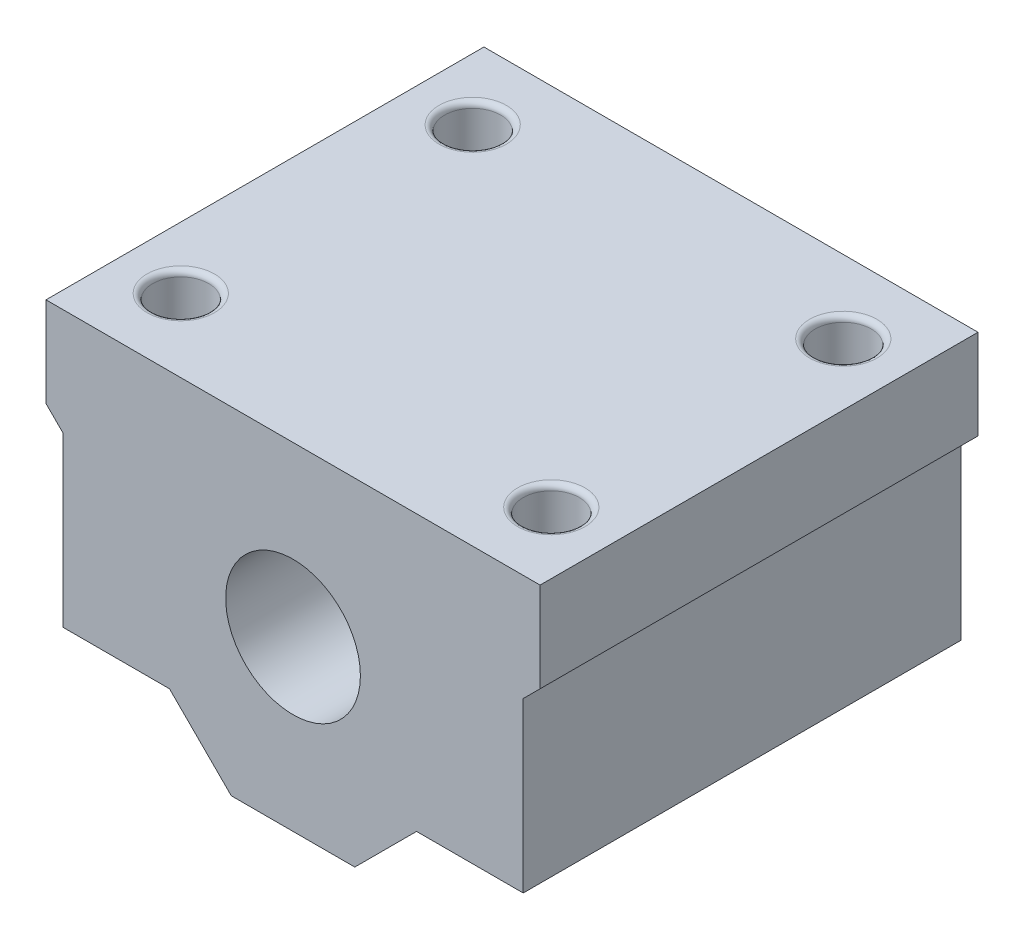
ISO-10303-21;
HEADER;
FILE_DESCRIPTION(('STEP AP214'),'2;1');
FILE_NAME('part.step','',(''),(''),'','','');
FILE_SCHEMA(('AUTOMOTIVE_DESIGN { 1 0 10303 214 1 1 1 1 }'));
ENDSEC;
DATA;
#1=APPLICATION_CONTEXT('core data for automotive mechanical design processes');
#2=APPLICATION_PROTOCOL_DEFINITION('international standard','automotive_design',2000,#1);
#3=PRODUCT_CONTEXT('',#1,'mechanical');
#4=PRODUCT('Part','Part','',(#3));
#5=PRODUCT_RELATED_PRODUCT_CATEGORY('part','',(#4));
#6=PRODUCT_DEFINITION_FORMATION('','',#4);
#7=PRODUCT_DEFINITION_CONTEXT('part definition',#1,'design');
#8=PRODUCT_DEFINITION('design','',#6,#7);
#9=PRODUCT_DEFINITION_SHAPE('','',#8);
#10=(LENGTH_UNIT() NAMED_UNIT(*) SI_UNIT(.MILLI.,.METRE.));
#11=(NAMED_UNIT(*) PLANE_ANGLE_UNIT() SI_UNIT($,.RADIAN.));
#12=(NAMED_UNIT(*) SI_UNIT($,.STERADIAN.) SOLID_ANGLE_UNIT());
#13=UNCERTAINTY_MEASURE_WITH_UNIT(LENGTH_MEASURE(1.E-05),#10,'distance_accuracy_value','');
#14=(GEOMETRIC_REPRESENTATION_CONTEXT(3) GLOBAL_UNCERTAINTY_ASSIGNED_CONTEXT((#13)) GLOBAL_UNIT_ASSIGNED_CONTEXT((#10,
#11,#12)) REPRESENTATION_CONTEXT('',''));
#15=CARTESIAN_POINT('',(0.,0.,0.));
#16=DIRECTION('',(0.,0.,1.));
#17=DIRECTION('',(1.,0.,0.));
#18=AXIS2_PLACEMENT_3D('',#15,#16,#17);
#19=CARTESIAN_POINT('',(0.,0.,39.));
#20=DIRECTION('',(0.,0.,1.));
#21=DIRECTION('',(1.,0.,0.));
#22=AXIS2_PLACEMENT_3D('',#19,#20,#21);
#23=PLANE('',#22);
#24=DIRECTION('',(0.,-1.,0.));
#25=VECTOR('',#24,1.);
#26=CARTESIAN_POINT('',(-22.,15.,39.));
#27=LINE('',#26,#25);
#28=CARTESIAN_POINT('',(-22.,15.,39.));
#29=VERTEX_POINT('',#28);
#30=CARTESIAN_POINT('',(-22.,7.,39.));
#31=VERTEX_POINT('',#30);
#32=EDGE_CURVE('E179',#29,#31,#27,.T.);
#33=ORIENTED_EDGE('',*,*,#32,.T.);
#34=DIRECTION('',(0.707106781186549,-0.707106781186546,0.));
#35=VECTOR('',#34,1.);
#36=CARTESIAN_POINT('',(-22.,7.,39.));
#37=LINE('',#36,#35);
#38=CARTESIAN_POINT('',(-20.5,5.5,39.));
#39=VERTEX_POINT('',#38);
#40=EDGE_CURVE('E107',#31,#39,#37,.T.);
#41=ORIENTED_EDGE('',*,*,#40,.T.);
#42=DIRECTION('',(0.,-1.,0.));
#43=VECTOR('',#42,1.);
#44=CARTESIAN_POINT('',(-20.5,5.5,39.));
#45=LINE('',#44,#43);
#46=CARTESIAN_POINT('',(-20.5,-9.5,39.));
#47=VERTEX_POINT('',#46);
#48=EDGE_CURVE('E342',#39,#47,#45,.T.);
#49=ORIENTED_EDGE('',*,*,#48,.T.);
#50=DIRECTION('',(1.,0.,0.));
#51=VECTOR('',#50,1.);
#52=CARTESIAN_POINT('',(-20.5,-9.5,39.));
#53=LINE('',#52,#51);
#54=CARTESIAN_POINT('',(-11.,-9.5,39.));
#55=VERTEX_POINT('',#54);
#56=EDGE_CURVE('E344',#47,#55,#53,.T.);
#57=ORIENTED_EDGE('',*,*,#56,.T.);
#58=DIRECTION('',(0.707106781186546,-0.707106781186549,0.));
#59=VECTOR('',#58,1.);
#60=CARTESIAN_POINT('',(-11.,-9.5,39.));
#61=LINE('',#60,#59);
#62=CARTESIAN_POINT('',(-5.50000000000002,-15.,39.));
#63=VERTEX_POINT('',#62);
#64=EDGE_CURVE('E346',#55,#63,#61,.T.);
#65=ORIENTED_EDGE('',*,*,#64,.T.);
#66=DIRECTION('',(1.,0.,0.));
#67=VECTOR('',#66,1.);
#68=CARTESIAN_POINT('',(-5.50000000000002,-15.,39.));
#69=LINE('',#68,#67);
#70=CARTESIAN_POINT('',(5.50000000000002,-15.,39.));
#71=VERTEX_POINT('',#70);
#72=EDGE_CURVE('E348',#63,#71,#69,.T.);
#73=ORIENTED_EDGE('',*,*,#72,.T.);
#74=DIRECTION('',(0.707106781186546,0.707106781186549,0.));
#75=VECTOR('',#74,1.);
#76=CARTESIAN_POINT('',(11.,-9.5,39.));
#77=LINE('',#76,#75);
#78=CARTESIAN_POINT('',(11.,-9.5,39.));
#79=VERTEX_POINT('',#78);
#80=EDGE_CURVE('E350',#71,#79,#77,.T.);
#81=ORIENTED_EDGE('',*,*,#80,.T.);
#82=DIRECTION('',(1.,0.,0.));
#83=VECTOR('',#82,1.);
#84=CARTESIAN_POINT('',(20.5,-9.5,39.));
#85=LINE('',#84,#83);
#86=CARTESIAN_POINT('',(20.5,-9.5,39.));
#87=VERTEX_POINT('',#86);
#88=EDGE_CURVE('E352',#79,#87,#85,.T.);
#89=ORIENTED_EDGE('',*,*,#88,.T.);
#90=DIRECTION('',(0.,1.,0.));
#91=VECTOR('',#90,1.);
#92=CARTESIAN_POINT('',(20.5,5.5,39.));
#93=LINE('',#92,#91);
#94=CARTESIAN_POINT('',(20.5,5.5,39.));
#95=VERTEX_POINT('',#94);
#96=EDGE_CURVE('E138',#87,#95,#93,.T.);
#97=ORIENTED_EDGE('',*,*,#96,.T.);
#98=DIRECTION('',(0.707106781186549,0.707106781186546,0.));
#99=VECTOR('',#98,1.);
#100=CARTESIAN_POINT('',(22.,7.,39.));
#101=LINE('',#100,#99);
#102=CARTESIAN_POINT('',(22.,7.,39.));
#103=VERTEX_POINT('',#102);
#104=EDGE_CURVE('E132',#95,#103,#101,.T.);
#105=ORIENTED_EDGE('',*,*,#104,.T.);
#106=DIRECTION('',(0.,1.,0.));
#107=VECTOR('',#106,1.);
#108=CARTESIAN_POINT('',(22.,15.,39.));
#109=LINE('',#108,#107);
#110=CARTESIAN_POINT('',(22.,15.,39.));
#111=VERTEX_POINT('',#110);
#112=EDGE_CURVE('E136',#103,#111,#109,.T.);
#113=ORIENTED_EDGE('',*,*,#112,.T.);
#114=DIRECTION('',(-1.,0.,0.));
#115=VECTOR('',#114,1.);
#116=CARTESIAN_POINT('',(22.,15.,39.));
#117=LINE('',#116,#115);
#118=EDGE_CURVE('E51',#111,#29,#117,.T.);
#119=ORIENTED_EDGE('',*,*,#118,.T.);
#120=EDGE_LOOP('',(#33,#41,#49,#57,#65,#73,#81,#89,#97,#105,#113,#119));
#121=FACE_BOUND('',#120,.T.);
#122=CARTESIAN_POINT('',(0.,0.,39.));
#123=DIRECTION('',(0.,0.,1.));
#124=DIRECTION('',(1.,0.,0.));
#125=AXIS2_PLACEMENT_3D('',#122,#123,#124);
#126=CIRCLE('',#125,6.);
#127=CARTESIAN_POINT('',(6.,0.,39.));
#128=VERTEX_POINT('',#127);
#129=EDGE_CURVE('E160',#128,#128,#126,.T.);
#130=ORIENTED_EDGE('',*,*,#129,.F.);
#131=EDGE_LOOP('',(#130));
#132=FACE_BOUND('',#131,.T.);
#133=ADVANCED_FACE('F34',(#121,#132),#23,.T.);
#134=CARTESIAN_POINT('',(0.,0.,0.));
#135=DIRECTION('',(0.,0.,1.));
#136=DIRECTION('',(1.,0.,0.));
#137=AXIS2_PLACEMENT_3D('',#134,#135,#136);
#138=PLANE('',#137);
#139=CARTESIAN_POINT('',(0.,0.,0.));
#140=DIRECTION('',(0.,0.,1.));
#141=DIRECTION('',(1.,0.,0.));
#142=AXIS2_PLACEMENT_3D('',#139,#140,#141);
#143=CIRCLE('',#142,7.50000000000001);
#144=CARTESIAN_POINT('',(7.50000000000001,0.,0.));
#145=VERTEX_POINT('',#144);
#146=EDGE_CURVE('E206',#145,#145,#143,.T.);
#147=ORIENTED_EDGE('',*,*,#146,.T.);
#148=EDGE_LOOP('',(#147));
#149=FACE_BOUND('',#148,.T.);
#150=DIRECTION('',(0.,-1.,0.));
#151=VECTOR('',#150,1.);
#152=CARTESIAN_POINT('',(-22.,15.,0.));
#153=LINE('',#152,#151);
#154=CARTESIAN_POINT('',(-22.,15.,0.));
#155=VERTEX_POINT('',#154);
#156=CARTESIAN_POINT('',(-22.,7.,0.));
#157=VERTEX_POINT('',#156);
#158=EDGE_CURVE('E156',#155,#157,#153,.T.);
#159=ORIENTED_EDGE('',*,*,#158,.F.);
#160=DIRECTION('',(-1.,0.,0.));
#161=VECTOR('',#160,1.);
#162=CARTESIAN_POINT('',(22.,15.,0.));
#163=LINE('',#162,#161);
#164=CARTESIAN_POINT('',(22.,15.,0.));
#165=VERTEX_POINT('',#164);
#166=EDGE_CURVE('E98',#165,#155,#163,.T.);
#167=ORIENTED_EDGE('',*,*,#166,.F.);
#168=DIRECTION('',(0.,1.,0.));
#169=VECTOR('',#168,1.);
#170=CARTESIAN_POINT('',(22.,15.,0.));
#171=LINE('',#170,#169);
#172=CARTESIAN_POINT('',(22.,7.,0.));
#173=VERTEX_POINT('',#172);
#174=EDGE_CURVE('E92',#173,#165,#171,.T.);
#175=ORIENTED_EDGE('',*,*,#174,.F.);
#176=DIRECTION('',(0.707106781186549,0.707106781186546,0.));
#177=VECTOR('',#176,1.);
#178=CARTESIAN_POINT('',(22.,7.,0.));
#179=LINE('',#178,#177);
#180=CARTESIAN_POINT('',(20.5,5.5,0.));
#181=VERTEX_POINT('',#180);
#182=EDGE_CURVE('E146',#181,#173,#179,.T.);
#183=ORIENTED_EDGE('',*,*,#182,.F.);
#184=DIRECTION('',(0.,1.,0.));
#185=VECTOR('',#184,1.);
#186=CARTESIAN_POINT('',(20.5,5.5,0.));
#187=LINE('',#186,#185);
#188=CARTESIAN_POINT('',(20.5,-9.5,0.));
#189=VERTEX_POINT('',#188);
#190=EDGE_CURVE('E174',#189,#181,#187,.T.);
#191=ORIENTED_EDGE('',*,*,#190,.F.);
#192=DIRECTION('',(1.,0.,0.));
#193=VECTOR('',#192,1.);
#194=CARTESIAN_POINT('',(20.5,-9.5,0.));
#195=LINE('',#194,#193);
#196=CARTESIAN_POINT('',(11.,-9.5,0.));
#197=VERTEX_POINT('',#196);
#198=EDGE_CURVE('E172',#197,#189,#195,.T.);
#199=ORIENTED_EDGE('',*,*,#198,.F.);
#200=DIRECTION('',(0.707106781186546,0.707106781186549,0.));
#201=VECTOR('',#200,1.);
#202=CARTESIAN_POINT('',(11.,-9.5,0.));
#203=LINE('',#202,#201);
#204=CARTESIAN_POINT('',(5.50000000000002,-15.,0.));
#205=VERTEX_POINT('',#204);
#206=EDGE_CURVE('E170',#205,#197,#203,.T.);
#207=ORIENTED_EDGE('',*,*,#206,.F.);
#208=DIRECTION('',(1.,0.,0.));
#209=VECTOR('',#208,1.);
#210=CARTESIAN_POINT('',(-5.50000000000002,-15.,0.));
#211=LINE('',#210,#209);
#212=CARTESIAN_POINT('',(-5.50000000000002,-15.,0.));
#213=VERTEX_POINT('',#212);
#214=EDGE_CURVE('E168',#213,#205,#211,.T.);
#215=ORIENTED_EDGE('',*,*,#214,.F.);
#216=DIRECTION('',(0.707106781186546,-0.707106781186549,0.));
#217=VECTOR('',#216,1.);
#218=CARTESIAN_POINT('',(-11.,-9.5,0.));
#219=LINE('',#218,#217);
#220=CARTESIAN_POINT('',(-11.,-9.5,0.));
#221=VERTEX_POINT('',#220);
#222=EDGE_CURVE('E166',#221,#213,#219,.T.);
#223=ORIENTED_EDGE('',*,*,#222,.F.);
#224=DIRECTION('',(1.,0.,0.));
#225=VECTOR('',#224,1.);
#226=CARTESIAN_POINT('',(-20.5,-9.5,0.));
#227=LINE('',#226,#225);
#228=CARTESIAN_POINT('',(-20.5,-9.5,0.));
#229=VERTEX_POINT('',#228);
#230=EDGE_CURVE('E164',#229,#221,#227,.T.);
#231=ORIENTED_EDGE('',*,*,#230,.F.);
#232=DIRECTION('',(0.,-1.,0.));
#233=VECTOR('',#232,1.);
#234=CARTESIAN_POINT('',(-20.5,5.5,0.));
#235=LINE('',#234,#233);
#236=CARTESIAN_POINT('',(-20.5,5.5,0.));
#237=VERTEX_POINT('',#236);
#238=EDGE_CURVE('E162',#237,#229,#235,.T.);
#239=ORIENTED_EDGE('',*,*,#238,.F.);
#240=DIRECTION('',(0.707106781186549,-0.707106781186546,0.));
#241=VECTOR('',#240,1.);
#242=CARTESIAN_POINT('',(-22.,7.,0.));
#243=LINE('',#242,#241);
#244=EDGE_CURVE('E159',#157,#237,#243,.T.);
#245=ORIENTED_EDGE('',*,*,#244,.F.);
#246=EDGE_LOOP('',(#159,#167,#175,#183,#191,#199,#207,#215,#223,#231,#239,#245));
#247=FACE_BOUND('',#246,.T.);
#248=ADVANCED_FACE('F255',(#149,#247),#138,.F.);
#249=CARTESIAN_POINT('',(-22.,15.,39.));
#250=DIRECTION('',(1.,0.,0.));
#251=DIRECTION('',(0.,0.,-1.));
#252=AXIS2_PLACEMENT_3D('',#249,#250,#251);
#253=PLANE('',#252);
#254=ORIENTED_EDGE('',*,*,#158,.T.);
#255=DIRECTION('',(0.,0.,-1.));
#256=VECTOR('',#255,1.);
#257=CARTESIAN_POINT('',(-22.,7.,39.));
#258=LINE('',#257,#256);
#259=EDGE_CURVE('E204',#31,#157,#258,.T.);
#260=ORIENTED_EDGE('',*,*,#259,.F.);
#261=ORIENTED_EDGE('',*,*,#32,.F.);
#262=DIRECTION('',(0.,0.,-1.));
#263=VECTOR('',#262,1.);
#264=CARTESIAN_POINT('',(-22.,15.,39.));
#265=LINE('',#264,#263);
#266=EDGE_CURVE('E152',#29,#155,#265,.T.);
#267=ORIENTED_EDGE('',*,*,#266,.T.);
#268=EDGE_LOOP('',(#254,#260,#261,#267));
#269=FACE_BOUND('',#268,.T.);
#270=ADVANCED_FACE('F260',(#269),#253,.F.);
#271=CARTESIAN_POINT('',(-22.,7.,39.));
#272=DIRECTION('',(0.707106781186546,0.707106781186549,0.));
#273=DIRECTION('',(-0.707106781186549,0.707106781186546,0.));
#274=AXIS2_PLACEMENT_3D('',#271,#272,#273);
#275=PLANE('',#274);
#276=ORIENTED_EDGE('',*,*,#244,.T.);
#277=DIRECTION('',(0.,0.,-1.));
#278=VECTOR('',#277,1.);
#279=CARTESIAN_POINT('',(-20.5,5.5,39.));
#280=LINE('',#279,#278);
#281=EDGE_CURVE('E201',#39,#237,#280,.T.);
#282=ORIENTED_EDGE('',*,*,#281,.F.);
#283=ORIENTED_EDGE('',*,*,#40,.F.);
#284=ORIENTED_EDGE('',*,*,#259,.T.);
#285=EDGE_LOOP('',(#276,#282,#283,#284));
#286=FACE_BOUND('',#285,.T.);
#287=ADVANCED_FACE('F297',(#286),#275,.F.);
#288=CARTESIAN_POINT('',(-20.5,5.5,39.));
#289=DIRECTION('',(1.,0.,0.));
#290=DIRECTION('',(0.,0.,-1.));
#291=AXIS2_PLACEMENT_3D('',#288,#289,#290);
#292=PLANE('',#291);
#293=ORIENTED_EDGE('',*,*,#238,.T.);
#294=DIRECTION('',(0.,0.,-1.));
#295=VECTOR('',#294,1.);
#296=CARTESIAN_POINT('',(-20.5,-9.5,39.));
#297=LINE('',#296,#295);
#298=EDGE_CURVE('E198',#47,#229,#297,.T.);
#299=ORIENTED_EDGE('',*,*,#298,.F.);
#300=ORIENTED_EDGE('',*,*,#48,.F.);
#301=ORIENTED_EDGE('',*,*,#281,.T.);
#302=EDGE_LOOP('',(#293,#299,#300,#301));
#303=FACE_BOUND('',#302,.T.);
#304=ADVANCED_FACE('F293',(#303),#292,.F.);
#305=CARTESIAN_POINT('',(-20.5,-9.5,39.));
#306=DIRECTION('',(0.,1.,0.));
#307=DIRECTION('',(-1.,0.,0.));
#308=AXIS2_PLACEMENT_3D('',#305,#306,#307);
#309=PLANE('',#308);
#310=CARTESIAN_POINT('',(-16.5,-9.5,6.5));
#311=DIRECTION('',(0.,-1.,0.));
#312=DIRECTION('',(1.,0.,0.));
#313=AXIS2_PLACEMENT_3D('',#310,#311,#312);
#314=CIRCLE('',#313,2.5);
#315=CARTESIAN_POINT('',(-14.,-9.5,6.5));
#316=VERTEX_POINT('',#315);
#317=EDGE_CURVE('E331',#316,#316,#314,.T.);
#318=ORIENTED_EDGE('',*,*,#317,.F.);
#319=EDGE_LOOP('',(#318));
#320=FACE_BOUND('',#319,.T.);
#321=CARTESIAN_POINT('',(-16.5,-9.5,32.5));
#322=DIRECTION('',(0.,-1.,0.));
#323=DIRECTION('',(1.,0.,0.));
#324=AXIS2_PLACEMENT_3D('',#321,#322,#323);
#325=CIRCLE('',#324,2.5);
#326=CARTESIAN_POINT('',(-14.,-9.5,32.5));
#327=VERTEX_POINT('',#326);
#328=EDGE_CURVE('E335',#327,#327,#325,.T.);
#329=ORIENTED_EDGE('',*,*,#328,.F.);
#330=EDGE_LOOP('',(#329));
#331=FACE_BOUND('',#330,.T.);
#332=ORIENTED_EDGE('',*,*,#230,.T.);
#333=DIRECTION('',(0.,0.,-1.));
#334=VECTOR('',#333,1.);
#335=CARTESIAN_POINT('',(-11.,-9.5,39.));
#336=LINE('',#335,#334);
#337=EDGE_CURVE('E195',#55,#221,#336,.T.);
#338=ORIENTED_EDGE('',*,*,#337,.F.);
#339=ORIENTED_EDGE('',*,*,#56,.F.);
#340=ORIENTED_EDGE('',*,*,#298,.T.);
#341=EDGE_LOOP('',(#332,#338,#339,#340));
#342=FACE_BOUND('',#341,.T.);
#343=ADVANCED_FACE('F289',(#320,#331,#342),#309,.F.);
#344=CARTESIAN_POINT('',(-11.,-9.5,39.));
#345=DIRECTION('',(0.707106781186549,0.707106781186546,0.));
#346=DIRECTION('',(-0.707106781186546,0.707106781186549,0.));
#347=AXIS2_PLACEMENT_3D('',#344,#345,#346);
#348=PLANE('',#347);
#349=ORIENTED_EDGE('',*,*,#222,.T.);
#350=DIRECTION('',(0.,0.,-1.));
#351=VECTOR('',#350,1.);
#352=CARTESIAN_POINT('',(-5.50000000000002,-15.,39.));
#353=LINE('',#352,#351);
#354=EDGE_CURVE('E192',#63,#213,#353,.T.);
#355=ORIENTED_EDGE('',*,*,#354,.F.);
#356=ORIENTED_EDGE('',*,*,#64,.F.);
#357=ORIENTED_EDGE('',*,*,#337,.T.);
#358=EDGE_LOOP('',(#349,#355,#356,#357));
#359=FACE_BOUND('',#358,.T.);
#360=ADVANCED_FACE('F285',(#359),#348,.F.);
#361=CARTESIAN_POINT('',(-5.50000000000002,-15.,39.));
#362=DIRECTION('',(0.,1.,0.));
#363=DIRECTION('',(0.,0.,1.));
#364=AXIS2_PLACEMENT_3D('',#361,#362,#363);
#365=PLANE('',#364);
#366=ORIENTED_EDGE('',*,*,#214,.T.);
#367=DIRECTION('',(0.,0.,-1.));
#368=VECTOR('',#367,1.);
#369=CARTESIAN_POINT('',(5.50000000000002,-15.,39.));
#370=LINE('',#369,#368);
#371=EDGE_CURVE('E189',#71,#205,#370,.T.);
#372=ORIENTED_EDGE('',*,*,#371,.F.);
#373=ORIENTED_EDGE('',*,*,#72,.F.);
#374=ORIENTED_EDGE('',*,*,#354,.T.);
#375=EDGE_LOOP('',(#366,#372,#373,#374));
#376=FACE_BOUND('',#375,.T.);
#377=ADVANCED_FACE('F281',(#376),#365,.F.);
#378=CARTESIAN_POINT('',(11.,-9.5,39.));
#379=DIRECTION('',(-0.707106781186549,0.707106781186546,0.));
#380=DIRECTION('',(-0.707106781186546,-0.707106781186549,0.));
#381=AXIS2_PLACEMENT_3D('',#378,#379,#380);
#382=PLANE('',#381);
#383=ORIENTED_EDGE('',*,*,#206,.T.);
#384=DIRECTION('',(0.,0.,-1.));
#385=VECTOR('',#384,1.);
#386=CARTESIAN_POINT('',(11.,-9.5,39.));
#387=LINE('',#386,#385);
#388=EDGE_CURVE('E186',#79,#197,#387,.T.);
#389=ORIENTED_EDGE('',*,*,#388,.F.);
#390=ORIENTED_EDGE('',*,*,#80,.F.);
#391=ORIENTED_EDGE('',*,*,#371,.T.);
#392=EDGE_LOOP('',(#383,#389,#390,#391));
#393=FACE_BOUND('',#392,.T.);
#394=ADVANCED_FACE('F277',(#393),#382,.F.);
#395=CARTESIAN_POINT('',(20.5,-9.5,39.));
#396=DIRECTION('',(0.,1.,0.));
#397=DIRECTION('',(-1.,0.,0.));
#398=AXIS2_PLACEMENT_3D('',#395,#396,#397);
#399=PLANE('',#398);
#400=CARTESIAN_POINT('',(16.5,-9.5,32.5));
#401=DIRECTION('',(0.,-1.,0.));
#402=DIRECTION('',(1.,0.,0.));
#403=AXIS2_PLACEMENT_3D('',#400,#401,#402);
#404=CIRCLE('',#403,2.5);
#405=CARTESIAN_POINT('',(19.,-9.5,32.5));
#406=VERTEX_POINT('',#405);
#407=EDGE_CURVE('E327',#406,#406,#404,.T.);
#408=ORIENTED_EDGE('',*,*,#407,.F.);
#409=EDGE_LOOP('',(#408));
#410=FACE_BOUND('',#409,.T.);
#411=CARTESIAN_POINT('',(16.5,-9.5,6.49999999999999));
#412=DIRECTION('',(0.,-1.,0.));
#413=DIRECTION('',(1.,0.,0.));
#414=AXIS2_PLACEMENT_3D('',#411,#412,#413);
#415=CIRCLE('',#414,2.49999999999999);
#416=CARTESIAN_POINT('',(19.,-9.5,6.49999999999999));
#417=VERTEX_POINT('',#416);
#418=EDGE_CURVE('E328',#417,#417,#415,.T.);
#419=ORIENTED_EDGE('',*,*,#418,.F.);
#420=EDGE_LOOP('',(#419));
#421=FACE_BOUND('',#420,.T.);
#422=ORIENTED_EDGE('',*,*,#198,.T.);
#423=DIRECTION('',(0.,0.,-1.));
#424=VECTOR('',#423,1.);
#425=CARTESIAN_POINT('',(20.5,-9.5,39.));
#426=LINE('',#425,#424);
#427=EDGE_CURVE('E183',#87,#189,#426,.T.);
#428=ORIENTED_EDGE('',*,*,#427,.F.);
#429=ORIENTED_EDGE('',*,*,#88,.F.);
#430=ORIENTED_EDGE('',*,*,#388,.T.);
#431=EDGE_LOOP('',(#422,#428,#429,#430));
#432=FACE_BOUND('',#431,.T.);
#433=ADVANCED_FACE('F273',(#410,#421,#432),#399,.F.);
#434=CARTESIAN_POINT('',(20.5,5.5,39.));
#435=DIRECTION('',(-1.,0.,0.));
#436=DIRECTION('',(0.,0.,1.));
#437=AXIS2_PLACEMENT_3D('',#434,#435,#436);
#438=PLANE('',#437);
#439=ORIENTED_EDGE('',*,*,#190,.T.);
#440=DIRECTION('',(0.,0.,-1.));
#441=VECTOR('',#440,1.);
#442=CARTESIAN_POINT('',(20.5,5.5,39.));
#443=LINE('',#442,#441);
#444=EDGE_CURVE('E147',#95,#181,#443,.T.);
#445=ORIENTED_EDGE('',*,*,#444,.F.);
#446=ORIENTED_EDGE('',*,*,#96,.F.);
#447=ORIENTED_EDGE('',*,*,#427,.T.);
#448=EDGE_LOOP('',(#439,#445,#446,#447));
#449=FACE_BOUND('',#448,.T.);
#450=ADVANCED_FACE('F270',(#449),#438,.F.);
#451=CARTESIAN_POINT('',(22.,7.,39.));
#452=DIRECTION('',(-0.707106781186546,0.707106781186549,0.));
#453=DIRECTION('',(-0.707106781186549,-0.707106781186546,0.));
#454=AXIS2_PLACEMENT_3D('',#451,#452,#453);
#455=PLANE('',#454);
#456=ORIENTED_EDGE('',*,*,#182,.T.);
#457=DIRECTION('',(0.,0.,-1.));
#458=VECTOR('',#457,1.);
#459=CARTESIAN_POINT('',(22.,7.,39.));
#460=LINE('',#459,#458);
#461=EDGE_CURVE('E143',#103,#173,#460,.T.);
#462=ORIENTED_EDGE('',*,*,#461,.F.);
#463=ORIENTED_EDGE('',*,*,#104,.F.);
#464=ORIENTED_EDGE('',*,*,#444,.T.);
#465=EDGE_LOOP('',(#456,#462,#463,#464));
#466=FACE_BOUND('',#465,.T.);
#467=ADVANCED_FACE('F144',(#466),#455,.F.);
#468=CARTESIAN_POINT('',(22.,15.,39.));
#469=DIRECTION('',(-1.,0.,0.));
#470=DIRECTION('',(0.,0.,1.));
#471=AXIS2_PLACEMENT_3D('',#468,#469,#470);
#472=PLANE('',#471);
#473=ORIENTED_EDGE('',*,*,#174,.T.);
#474=DIRECTION('',(0.,0.,-1.));
#475=VECTOR('',#474,1.);
#476=CARTESIAN_POINT('',(22.,15.,39.));
#477=LINE('',#476,#475);
#478=EDGE_CURVE('E148',#111,#165,#477,.T.);
#479=ORIENTED_EDGE('',*,*,#478,.F.);
#480=ORIENTED_EDGE('',*,*,#112,.F.);
#481=ORIENTED_EDGE('',*,*,#461,.T.);
#482=EDGE_LOOP('',(#473,#479,#480,#481));
#483=FACE_BOUND('',#482,.T.);
#484=ADVANCED_FACE('F150',(#483),#472,.F.);
#485=CARTESIAN_POINT('',(22.,15.,39.));
#486=DIRECTION('',(0.,-1.,0.));
#487=DIRECTION('',(0.,0.,-1.));
#488=AXIS2_PLACEMENT_3D('',#485,#486,#487);
#489=PLANE('',#488);
#490=CARTESIAN_POINT('',(-16.5,15.,32.5));
#491=DIRECTION('',(0.,-1.,0.));
#492=DIRECTION('',(0.,0.,-1.));
#493=AXIS2_PLACEMENT_3D('',#490,#491,#492);
#494=CIRCLE('',#493,3.);
#495=CARTESIAN_POINT('',(-16.5,15.,29.5));
#496=VERTEX_POINT('',#495);
#497=EDGE_CURVE('E221',#496,#496,#494,.T.);
#498=ORIENTED_EDGE('',*,*,#497,.T.);
#499=EDGE_LOOP('',(#498));
#500=FACE_BOUND('',#499,.T.);
#501=CARTESIAN_POINT('',(16.5,15.,32.5));
#502=DIRECTION('',(0.,-1.,0.));
#503=DIRECTION('',(0.,0.,-1.));
#504=AXIS2_PLACEMENT_3D('',#501,#502,#503);
#505=CIRCLE('',#504,3.);
#506=CARTESIAN_POINT('',(16.5,15.,29.5));
#507=VERTEX_POINT('',#506);
#508=EDGE_CURVE('E218',#507,#507,#505,.T.);
#509=ORIENTED_EDGE('',*,*,#508,.T.);
#510=EDGE_LOOP('',(#509));
#511=FACE_BOUND('',#510,.T.);
#512=CARTESIAN_POINT('',(16.5,15.,6.49999999999999));
#513=DIRECTION('',(0.,-1.,0.));
#514=DIRECTION('',(0.,0.,-1.));
#515=AXIS2_PLACEMENT_3D('',#512,#513,#514);
#516=CIRCLE('',#515,2.99999999999999);
#517=CARTESIAN_POINT('',(16.5,15.,3.5));
#518=VERTEX_POINT('',#517);
#519=EDGE_CURVE('E215',#518,#518,#516,.T.);
#520=ORIENTED_EDGE('',*,*,#519,.T.);
#521=EDGE_LOOP('',(#520));
#522=FACE_BOUND('',#521,.T.);
#523=CARTESIAN_POINT('',(-16.5,15.,6.5));
#524=DIRECTION('',(0.,-1.,0.));
#525=DIRECTION('',(0.,0.,-1.));
#526=AXIS2_PLACEMENT_3D('',#523,#524,#525);
#527=CIRCLE('',#526,3.);
#528=CARTESIAN_POINT('',(-16.5,15.,3.5));
#529=VERTEX_POINT('',#528);
#530=EDGE_CURVE('E212',#529,#529,#527,.T.);
#531=ORIENTED_EDGE('',*,*,#530,.T.);
#532=EDGE_LOOP('',(#531));
#533=FACE_BOUND('',#532,.T.);
#534=ORIENTED_EDGE('',*,*,#166,.T.);
#535=ORIENTED_EDGE('',*,*,#266,.F.);
#536=ORIENTED_EDGE('',*,*,#118,.F.);
#537=ORIENTED_EDGE('',*,*,#478,.T.);
#538=EDGE_LOOP('',(#534,#535,#536,#537));
#539=FACE_BOUND('',#538,.T.);
#540=ADVANCED_FACE('F241',(#500,#511,#522,#533,#539),#489,.F.);
#541=CARTESIAN_POINT('',(0.,0.,39.));
#542=DIRECTION('',(0.,0.,-1.));
#543=DIRECTION('',(-1.,0.,0.));
#544=AXIS2_PLACEMENT_3D('',#541,#542,#543);
#545=CYLINDRICAL_SURFACE('',#544,6.);
#546=CARTESIAN_POINT('',(0.,0.,1.50000000000002));
#547=DIRECTION('',(0.,0.,1.));
#548=DIRECTION('',(1.,0.,0.));
#549=AXIS2_PLACEMENT_3D('',#546,#547,#548);
#550=CIRCLE('',#549,6.);
#551=CARTESIAN_POINT('',(6.,0.,1.50000000000002));
#552=VERTEX_POINT('',#551);
#553=EDGE_CURVE('E209',#552,#552,#550,.F.);
#554=ORIENTED_EDGE('',*,*,#553,.T.);
#555=EDGE_LOOP('',(#554));
#556=FACE_BOUND('',#555,.T.);
#557=ORIENTED_EDGE('',*,*,#129,.T.);
#558=EDGE_LOOP('',(#557));
#559=FACE_BOUND('',#558,.T.);
#560=ADVANCED_FACE('F244',(#556,#559),#545,.F.);
#561=CARTESIAN_POINT('',(-16.5,29.5,32.5));
#562=DIRECTION('',(0.,-1.,0.));
#563=DIRECTION('',(1.,0.,0.));
#564=AXIS2_PLACEMENT_3D('',#561,#562,#563);
#565=CYLINDRICAL_SURFACE('',#564,2.5);
#566=CARTESIAN_POINT('',(-16.5,14.5,32.5));
#567=DIRECTION('',(0.,-1.,0.));
#568=DIRECTION('',(0.,0.,-1.));
#569=AXIS2_PLACEMENT_3D('',#566,#567,#568);
#570=CIRCLE('',#569,2.5);
#571=CARTESIAN_POINT('',(-16.5,14.5,30.));
#572=VERTEX_POINT('',#571);
#573=EDGE_CURVE('E224',#572,#572,#570,.F.);
#574=ORIENTED_EDGE('',*,*,#573,.T.);
#575=EDGE_LOOP('',(#574));
#576=FACE_BOUND('',#575,.T.);
#577=ORIENTED_EDGE('',*,*,#328,.T.);
#578=EDGE_LOOP('',(#577));
#579=FACE_BOUND('',#578,.T.);
#580=ADVANCED_FACE('F381',(#576,#579),#565,.F.);
#581=CARTESIAN_POINT('',(-16.5,29.5,6.5));
#582=DIRECTION('',(0.,-1.,0.));
#583=DIRECTION('',(1.,0.,0.));
#584=AXIS2_PLACEMENT_3D('',#581,#582,#583);
#585=CYLINDRICAL_SURFACE('',#584,2.5);
#586=CARTESIAN_POINT('',(-16.5,14.5,6.5));
#587=DIRECTION('',(0.,-1.,0.));
#588=DIRECTION('',(0.,0.,-1.));
#589=AXIS2_PLACEMENT_3D('',#586,#587,#588);
#590=CIRCLE('',#589,2.5);
#591=CARTESIAN_POINT('',(-16.5,14.5,4.));
#592=VERTEX_POINT('',#591);
#593=EDGE_CURVE('E11',#592,#592,#590,.F.);
#594=ORIENTED_EDGE('',*,*,#593,.T.);
#595=EDGE_LOOP('',(#594));
#596=FACE_BOUND('',#595,.T.);
#597=ORIENTED_EDGE('',*,*,#317,.T.);
#598=EDGE_LOOP('',(#597));
#599=FACE_BOUND('',#598,.T.);
#600=ADVANCED_FACE('F386',(#596,#599),#585,.F.);
#601=CARTESIAN_POINT('',(16.5,29.5,6.49999999999999));
#602=DIRECTION('',(0.,-1.,0.));
#603=DIRECTION('',(1.,0.,0.));
#604=AXIS2_PLACEMENT_3D('',#601,#602,#603);
#605=CYLINDRICAL_SURFACE('',#604,2.49999999999999);
#606=CARTESIAN_POINT('',(16.5,14.5,6.49999999999999));
#607=DIRECTION('',(0.,-1.,0.));
#608=DIRECTION('',(0.,0.,-1.));
#609=AXIS2_PLACEMENT_3D('',#606,#607,#608);
#610=CIRCLE('',#609,2.49999999999999);
#611=CARTESIAN_POINT('',(16.5,14.5,4.));
#612=VERTEX_POINT('',#611);
#613=EDGE_CURVE('E43',#612,#612,#610,.F.);
#614=ORIENTED_EDGE('',*,*,#613,.T.);
#615=EDGE_LOOP('',(#614));
#616=FACE_BOUND('',#615,.T.);
#617=ORIENTED_EDGE('',*,*,#418,.T.);
#618=EDGE_LOOP('',(#617));
#619=FACE_BOUND('',#618,.T.);
#620=ADVANCED_FACE('F232',(#616,#619),#605,.F.);
#621=CARTESIAN_POINT('',(16.5,29.5,32.5));
#622=DIRECTION('',(0.,-1.,0.));
#623=DIRECTION('',(1.,0.,0.));
#624=AXIS2_PLACEMENT_3D('',#621,#622,#623);
#625=CYLINDRICAL_SURFACE('',#624,2.5);
#626=CARTESIAN_POINT('',(16.5,14.5,32.5));
#627=DIRECTION('',(0.,-1.,0.));
#628=DIRECTION('',(0.,0.,-1.));
#629=AXIS2_PLACEMENT_3D('',#626,#627,#628);
#630=CIRCLE('',#629,2.5);
#631=CARTESIAN_POINT('',(16.5,14.5,30.));
#632=VERTEX_POINT('',#631);
#633=EDGE_CURVE('E227',#632,#632,#630,.F.);
#634=ORIENTED_EDGE('',*,*,#633,.T.);
#635=EDGE_LOOP('',(#634));
#636=FACE_BOUND('',#635,.T.);
#637=ORIENTED_EDGE('',*,*,#407,.T.);
#638=EDGE_LOOP('',(#637));
#639=FACE_BOUND('',#638,.T.);
#640=ADVANCED_FACE('F308',(#636,#639),#625,.F.);
#641=CARTESIAN_POINT('',(0.,0.,0.));
#642=DIRECTION('',(0.,0.,-1.));
#643=DIRECTION('',(-1.,0.,0.));
#644=AXIS2_PLACEMENT_3D('',#641,#642,#643);
#645=CONICAL_SURFACE('',#644,7.50000000000001,0.785398163397445);
#646=ORIENTED_EDGE('',*,*,#553,.F.);
#647=EDGE_LOOP('',(#646));
#648=FACE_BOUND('',#647,.T.);
#649=ORIENTED_EDGE('',*,*,#146,.F.);
#650=EDGE_LOOP('',(#649));
#651=FACE_BOUND('',#650,.T.);
#652=ADVANCED_FACE('F304',(#648,#651),#645,.F.);
#653=CARTESIAN_POINT('',(-16.5,14.5,32.5));
#654=DIRECTION('',(0.,-1.,0.));
#655=DIRECTION('',(0.,0.,-1.));
#656=AXIS2_PLACEMENT_3D('',#653,#654,#655);
#657=TOROIDAL_SURFACE('',#656,3.,0.5);
#658=ORIENTED_EDGE('',*,*,#573,.F.);
#659=EDGE_LOOP('',(#658));
#660=FACE_BOUND('',#659,.T.);
#661=ORIENTED_EDGE('',*,*,#497,.F.);
#662=EDGE_LOOP('',(#661));
#663=FACE_BOUND('',#662,.T.);
#664=ADVANCED_FACE('F307',(#660,#663),#657,.T.);
#665=CARTESIAN_POINT('',(16.5,14.5,32.5));
#666=DIRECTION('',(0.,-1.,0.));
#667=DIRECTION('',(0.,0.,-1.));
#668=AXIS2_PLACEMENT_3D('',#665,#666,#667);
#669=TOROIDAL_SURFACE('',#668,3.,0.5);
#670=ORIENTED_EDGE('',*,*,#633,.F.);
#671=EDGE_LOOP('',(#670));
#672=FACE_BOUND('',#671,.T.);
#673=ORIENTED_EDGE('',*,*,#508,.F.);
#674=EDGE_LOOP('',(#673));
#675=FACE_BOUND('',#674,.T.);
#676=ADVANCED_FACE('F238',(#672,#675),#669,.T.);
#677=CARTESIAN_POINT('',(16.5,14.5,6.49999999999999));
#678=DIRECTION('',(0.,-1.,0.));
#679=DIRECTION('',(0.,0.,-1.));
#680=AXIS2_PLACEMENT_3D('',#677,#678,#679);
#681=TOROIDAL_SURFACE('',#680,2.99999999999999,0.5);
#682=ORIENTED_EDGE('',*,*,#613,.F.);
#683=EDGE_LOOP('',(#682));
#684=FACE_BOUND('',#683,.T.);
#685=ORIENTED_EDGE('',*,*,#519,.F.);
#686=EDGE_LOOP('',(#685));
#687=FACE_BOUND('',#686,.T.);
#688=ADVANCED_FACE('F235',(#684,#687),#681,.T.);
#689=CARTESIAN_POINT('',(-16.5,14.5,6.5));
#690=DIRECTION('',(0.,-1.,0.));
#691=DIRECTION('',(0.,0.,-1.));
#692=AXIS2_PLACEMENT_3D('',#689,#690,#691);
#693=TOROIDAL_SURFACE('',#692,3.,0.5);
#694=ORIENTED_EDGE('',*,*,#593,.F.);
#695=EDGE_LOOP('',(#694));
#696=FACE_BOUND('',#695,.T.);
#697=ORIENTED_EDGE('',*,*,#530,.F.);
#698=EDGE_LOOP('',(#697));
#699=FACE_BOUND('',#698,.T.);
#700=ADVANCED_FACE('F36',(#696,#699),#693,.T.);
#701=CLOSED_SHELL('',(#133,#248,#270,#287,#304,#343,#360,#377,#394,#433,#450,#467,#484,#540,
#560,#580,#600,#620,#640,#652,#664,#676,#688,#700));
#702=MANIFOLD_SOLID_BREP('B2',#701);
#703=ADVANCED_BREP_SHAPE_REPRESENTATION('',(#18,#702),#14);
#704=SHAPE_DEFINITION_REPRESENTATION(#9,#703);
ENDSEC;
END-ISO-10303-21;
